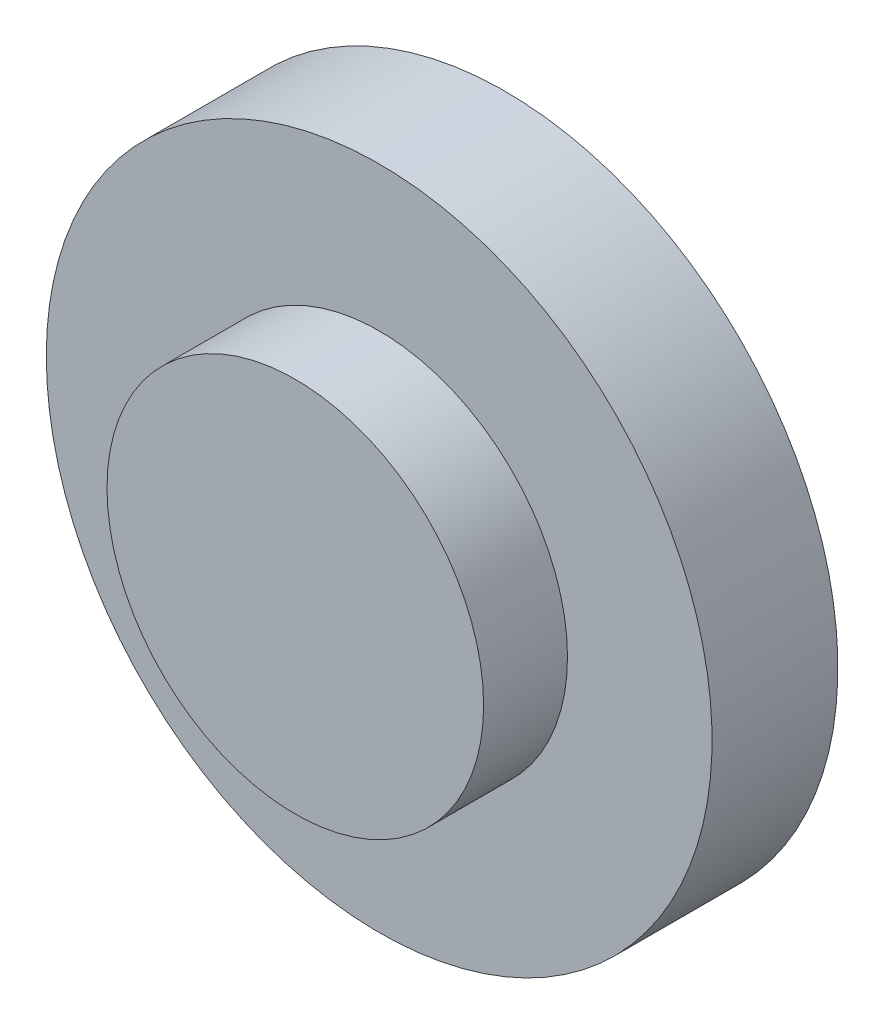
ISO-10303-21;
HEADER;
FILE_DESCRIPTION(('STEP AP214'),'2;1');
FILE_NAME('part.step','',(''),(''),'','','');
FILE_SCHEMA(('AUTOMOTIVE_DESIGN { 1 0 10303 214 1 1 1 1 }'));
ENDSEC;
DATA;
#1=APPLICATION_CONTEXT('core data for automotive mechanical design processes');
#2=APPLICATION_PROTOCOL_DEFINITION('international standard','automotive_design',2000,#1);
#3=PRODUCT_CONTEXT('',#1,'mechanical');
#4=PRODUCT('Part','Part','',(#3));
#5=PRODUCT_RELATED_PRODUCT_CATEGORY('part','',(#4));
#6=PRODUCT_DEFINITION_FORMATION('','',#4);
#7=PRODUCT_DEFINITION_CONTEXT('part definition',#1,'design');
#8=PRODUCT_DEFINITION('design','',#6,#7);
#9=PRODUCT_DEFINITION_SHAPE('','',#8);
#10=(LENGTH_UNIT() NAMED_UNIT(*) SI_UNIT(.MILLI.,.METRE.));
#11=(NAMED_UNIT(*) PLANE_ANGLE_UNIT() SI_UNIT($,.RADIAN.));
#12=(NAMED_UNIT(*) SI_UNIT($,.STERADIAN.) SOLID_ANGLE_UNIT());
#13=UNCERTAINTY_MEASURE_WITH_UNIT(LENGTH_MEASURE(1.E-05),#10,'distance_accuracy_value','');
#14=(GEOMETRIC_REPRESENTATION_CONTEXT(3) GLOBAL_UNCERTAINTY_ASSIGNED_CONTEXT((#13)) GLOBAL_UNIT_ASSIGNED_CONTEXT((#10,
#11,#12)) REPRESENTATION_CONTEXT('',''));
#15=CARTESIAN_POINT('',(0.,0.,0.));
#16=DIRECTION('',(0.,0.,1.));
#17=DIRECTION('',(1.,0.,0.));
#18=AXIS2_PLACEMENT_3D('',#15,#16,#17);
#19=CARTESIAN_POINT('',(13.8062417359389,21.7292116661534,1.5));
#20=DIRECTION('',(0.,0.,1.));
#21=DIRECTION('',(1.,0.,0.));
#22=AXIS2_PLACEMENT_3D('',#19,#20,#21);
#23=PLANE('',#22);
#24=CARTESIAN_POINT('',(14.2651965268974,22.1881664571119,1.5));
#25=DIRECTION('',(0.,0.,-1.));
#26=DIRECTION('',(-1.,0.,0.));
#27=AXIS2_PLACEMENT_3D('',#24,#25,#26);
#28=CIRCLE('',#27,0.448954790958499);
#29=CARTESIAN_POINT('',(13.8162417359389,22.1881664571119,1.5));
#30=VERTEX_POINT('',#29);
#31=EDGE_CURVE('E18',#30,#30,#28,.T.);
#32=ORIENTED_EDGE('',*,*,#31,.F.);
#33=EDGE_LOOP('',(#32));
#34=FACE_BOUND('',#33,.T.);
#35=ADVANCED_FACE('F14',(#34),#23,.T.);
#36=CARTESIAN_POINT('',(14.2651965268974,22.1881664571119,1.5));
#37=DIRECTION('',(0.,0.,-1.));
#38=DIRECTION('',(-1.,0.,0.));
#39=AXIS2_PLACEMENT_3D('',#36,#37,#38);
#40=CYLINDRICAL_SURFACE('',#39,0.448954790958499);
#41=CARTESIAN_POINT('',(14.2651965268974,22.1881664571119,1.3));
#42=DIRECTION('',(0.,0.,-1.));
#43=DIRECTION('',(-1.,0.,0.));
#44=AXIS2_PLACEMENT_3D('',#41,#42,#43);
#45=CIRCLE('',#44,0.448954790958499);
#46=CARTESIAN_POINT('',(13.8162417359389,22.1881664571119,1.3));
#47=VERTEX_POINT('',#46);
#48=EDGE_CURVE('E27',#47,#47,#45,.T.);
#49=ORIENTED_EDGE('',*,*,#48,.F.);
#50=EDGE_LOOP('',(#49));
#51=FACE_BOUND('',#50,.T.);
#52=ORIENTED_EDGE('',*,*,#31,.T.);
#53=EDGE_LOOP('',(#52));
#54=FACE_BOUND('',#53,.T.);
#55=ADVANCED_FACE('F35',(#51,#54),#40,.T.);
#56=CARTESIAN_POINT('',(13.4615387408658,21.3845086710804,1.3));
#57=DIRECTION('',(0.,0.,1.));
#58=DIRECTION('',(1.,0.,0.));
#59=AXIS2_PLACEMENT_3D('',#56,#57,#58);
#60=PLANE('',#59);
#61=ORIENTED_EDGE('',*,*,#48,.T.);
#62=EDGE_LOOP('',(#61));
#63=FACE_BOUND('',#62,.T.);
#64=CARTESIAN_POINT('',(14.2651965268974,22.1881664571119,1.3));
#65=DIRECTION('',(0.,0.,-1.));
#66=DIRECTION('',(-1.,0.,0.));
#67=AXIS2_PLACEMENT_3D('',#64,#65,#66);
#68=CIRCLE('',#67,0.793657786031549);
#69=CARTESIAN_POINT('',(13.4715387408659,22.1881664571119,1.3));
#70=VERTEX_POINT('',#69);
#71=EDGE_CURVE('E22',#70,#70,#68,.T.);
#72=ORIENTED_EDGE('',*,*,#71,.F.);
#73=EDGE_LOOP('',(#72));
#74=FACE_BOUND('',#73,.T.);
#75=ADVANCED_FACE('F43',(#63,#74),#60,.T.);
#76=CARTESIAN_POINT('',(14.2651965268974,22.1881664571119,1.3));
#77=DIRECTION('',(0.,0.,-1.));
#78=DIRECTION('',(-1.,0.,0.));
#79=AXIS2_PLACEMENT_3D('',#76,#77,#78);
#80=CYLINDRICAL_SURFACE('',#79,0.793657786031549);
#81=CARTESIAN_POINT('',(14.2651965268974,22.1881664571119,1.));
#82=DIRECTION('',(0.,0.,-1.));
#83=DIRECTION('',(-1.,0.,0.));
#84=AXIS2_PLACEMENT_3D('',#81,#82,#83);
#85=CIRCLE('',#84,0.793657786031549);
#86=CARTESIAN_POINT('',(13.4715387408659,22.1881664571119,1.));
#87=VERTEX_POINT('',#86);
#88=EDGE_CURVE('E10',#87,#87,#85,.T.);
#89=ORIENTED_EDGE('',*,*,#88,.F.);
#90=EDGE_LOOP('',(#89));
#91=FACE_BOUND('',#90,.T.);
#92=ORIENTED_EDGE('',*,*,#71,.T.);
#93=EDGE_LOOP('',(#92));
#94=FACE_BOUND('',#93,.T.);
#95=ADVANCED_FACE('F47',(#91,#94),#80,.T.);
#96=CARTESIAN_POINT('',(15.0688543129289,21.3845086710804,1.));
#97=DIRECTION('',(0.,0.,-1.));
#98=DIRECTION('',(-1.,0.,0.));
#99=AXIS2_PLACEMENT_3D('',#96,#97,#98);
#100=PLANE('',#99);
#101=ORIENTED_EDGE('',*,*,#88,.T.);
#102=EDGE_LOOP('',(#101));
#103=FACE_BOUND('',#102,.T.);
#104=ADVANCED_FACE('F16',(#103),#100,.T.);
#105=CLOSED_SHELL('',(#35,#55,#75,#95,#104));
#106=MANIFOLD_SOLID_BREP('B1',#105);
#107=ADVANCED_BREP_SHAPE_REPRESENTATION('',(#18,#106),#14);
#108=SHAPE_DEFINITION_REPRESENTATION(#9,#107);
ENDSEC;
END-ISO-10303-21;
